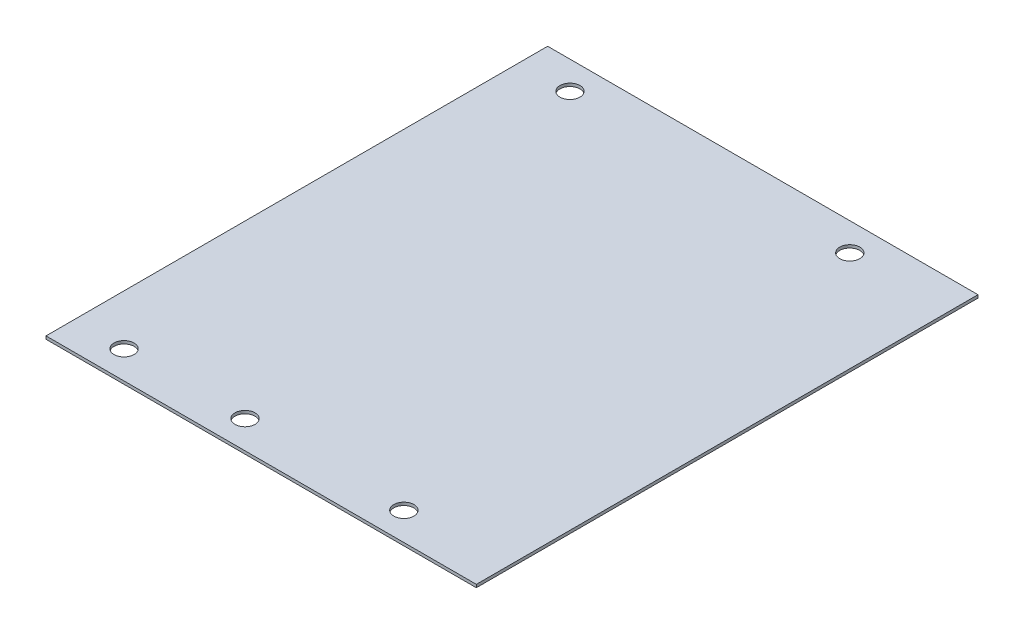
ISO-10303-21;
HEADER;
FILE_DESCRIPTION(('STEP AP214'),'2;1');
FILE_NAME('part.step','',(''),(''),'','','');
FILE_SCHEMA(('AUTOMOTIVE_DESIGN { 1 0 10303 214 1 1 1 1 }'));
ENDSEC;
DATA;
#1=APPLICATION_CONTEXT('core data for automotive mechanical design processes');
#2=APPLICATION_PROTOCOL_DEFINITION('international standard','automotive_design',2000,#1);
#3=PRODUCT_CONTEXT('',#1,'mechanical');
#4=PRODUCT('Part','Part','',(#3));
#5=PRODUCT_RELATED_PRODUCT_CATEGORY('part','',(#4));
#6=PRODUCT_DEFINITION_FORMATION('','',#4);
#7=PRODUCT_DEFINITION_CONTEXT('part definition',#1,'design');
#8=PRODUCT_DEFINITION('design','',#6,#7);
#9=PRODUCT_DEFINITION_SHAPE('','',#8);
#10=(LENGTH_UNIT() NAMED_UNIT(*) SI_UNIT(.MILLI.,.METRE.));
#11=(NAMED_UNIT(*) PLANE_ANGLE_UNIT() SI_UNIT($,.RADIAN.));
#12=(NAMED_UNIT(*) SI_UNIT($,.STERADIAN.) SOLID_ANGLE_UNIT());
#13=UNCERTAINTY_MEASURE_WITH_UNIT(LENGTH_MEASURE(1.E-05),#10,'distance_accuracy_value','');
#14=(GEOMETRIC_REPRESENTATION_CONTEXT(3) GLOBAL_UNCERTAINTY_ASSIGNED_CONTEXT((#13)) GLOBAL_UNIT_ASSIGNED_CONTEXT((#10,
#11,#12)) REPRESENTATION_CONTEXT('',''));
#15=CARTESIAN_POINT('',(0.,0.,0.));
#16=DIRECTION('',(0.,0.,1.));
#17=DIRECTION('',(1.,0.,0.));
#18=AXIS2_PLACEMENT_3D('',#15,#16,#17);
#19=CARTESIAN_POINT('',(-193.,2.66,225.));
#20=DIRECTION('',(1.,0.,0.));
#21=DIRECTION('',(0.,0.,-1.));
#22=AXIS2_PLACEMENT_3D('',#19,#20,#21);
#23=PLANE('',#22);
#24=DIRECTION('',(0.,0.,1.));
#25=VECTOR('',#24,1.);
#26=CARTESIAN_POINT('',(-193.,0.,225.));
#27=LINE('',#26,#25);
#28=CARTESIAN_POINT('',(-193.,0.,-225.));
#29=VERTEX_POINT('',#28);
#30=CARTESIAN_POINT('',(-193.,0.,225.));
#31=VERTEX_POINT('',#30);
#32=EDGE_CURVE('E103',#29,#31,#27,.T.);
#33=ORIENTED_EDGE('',*,*,#32,.T.);
#34=DIRECTION('',(0.,-1.,0.));
#35=VECTOR('',#34,1.);
#36=CARTESIAN_POINT('',(-193.,2.66,225.));
#37=LINE('',#36,#35);
#38=CARTESIAN_POINT('',(-193.,2.66,225.));
#39=VERTEX_POINT('',#38);
#40=EDGE_CURVE('E11',#39,#31,#37,.T.);
#41=ORIENTED_EDGE('',*,*,#40,.F.);
#42=DIRECTION('',(0.,0.,1.));
#43=VECTOR('',#42,1.);
#44=CARTESIAN_POINT('',(-193.,2.66,225.));
#45=LINE('',#44,#43);
#46=CARTESIAN_POINT('',(-193.,2.66,-225.));
#47=VERTEX_POINT('',#46);
#48=EDGE_CURVE('E90',#47,#39,#45,.T.);
#49=ORIENTED_EDGE('',*,*,#48,.F.);
#50=DIRECTION('',(0.,-1.,0.));
#51=VECTOR('',#50,1.);
#52=CARTESIAN_POINT('',(-193.,2.66,-225.));
#53=LINE('',#52,#51);
#54=EDGE_CURVE('E99',#47,#29,#53,.T.);
#55=ORIENTED_EDGE('',*,*,#54,.T.);
#56=EDGE_LOOP('',(#33,#41,#49,#55));
#57=FACE_BOUND('',#56,.T.);
#58=ADVANCED_FACE('F37',(#57),#23,.F.);
#59=CARTESIAN_POINT('',(193.,2.66,225.));
#60=DIRECTION('',(0.,0.,-1.));
#61=DIRECTION('',(-1.,0.,0.));
#62=AXIS2_PLACEMENT_3D('',#59,#60,#61);
#63=PLANE('',#62);
#64=DIRECTION('',(1.,0.,0.));
#65=VECTOR('',#64,1.);
#66=CARTESIAN_POINT('',(193.,0.,225.));
#67=LINE('',#66,#65);
#68=CARTESIAN_POINT('',(193.,0.,225.));
#69=VERTEX_POINT('',#68);
#70=EDGE_CURVE('E94',#31,#69,#67,.T.);
#71=ORIENTED_EDGE('',*,*,#70,.T.);
#72=DIRECTION('',(0.,-1.,0.));
#73=VECTOR('',#72,1.);
#74=CARTESIAN_POINT('',(193.,2.66,225.));
#75=LINE('',#74,#73);
#76=CARTESIAN_POINT('',(193.,2.66,225.));
#77=VERTEX_POINT('',#76);
#78=EDGE_CURVE('E46',#77,#69,#75,.T.);
#79=ORIENTED_EDGE('',*,*,#78,.F.);
#80=DIRECTION('',(1.,0.,0.));
#81=VECTOR('',#80,1.);
#82=CARTESIAN_POINT('',(193.,2.66,225.));
#83=LINE('',#82,#81);
#84=EDGE_CURVE('E85',#39,#77,#83,.T.);
#85=ORIENTED_EDGE('',*,*,#84,.F.);
#86=ORIENTED_EDGE('',*,*,#40,.T.);
#87=EDGE_LOOP('',(#71,#79,#85,#86));
#88=FACE_BOUND('',#87,.T.);
#89=ADVANCED_FACE('F93',(#88),#63,.F.);
#90=CARTESIAN_POINT('',(193.,2.66,225.));
#91=DIRECTION('',(-1.,0.,0.));
#92=DIRECTION('',(0.,0.,1.));
#93=AXIS2_PLACEMENT_3D('',#90,#91,#92);
#94=PLANE('',#93);
#95=DIRECTION('',(0.,0.,-1.));
#96=VECTOR('',#95,1.);
#97=CARTESIAN_POINT('',(193.,0.,225.));
#98=LINE('',#97,#96);
#99=CARTESIAN_POINT('',(193.,0.,-225.));
#100=VERTEX_POINT('',#99);
#101=EDGE_CURVE('E72',#69,#100,#98,.T.);
#102=ORIENTED_EDGE('',*,*,#101,.T.);
#103=DIRECTION('',(0.,-1.,0.));
#104=VECTOR('',#103,1.);
#105=CARTESIAN_POINT('',(193.,2.66,-225.));
#106=LINE('',#105,#104);
#107=CARTESIAN_POINT('',(193.,2.66,-225.));
#108=VERTEX_POINT('',#107);
#109=EDGE_CURVE('E95',#108,#100,#106,.T.);
#110=ORIENTED_EDGE('',*,*,#109,.F.);
#111=DIRECTION('',(0.,0.,-1.));
#112=VECTOR('',#111,1.);
#113=CARTESIAN_POINT('',(193.,2.66,225.));
#114=LINE('',#113,#112);
#115=EDGE_CURVE('E88',#77,#108,#114,.T.);
#116=ORIENTED_EDGE('',*,*,#115,.F.);
#117=ORIENTED_EDGE('',*,*,#78,.T.);
#118=EDGE_LOOP('',(#102,#110,#116,#117));
#119=FACE_BOUND('',#118,.T.);
#120=ADVANCED_FACE('F97',(#119),#94,.F.);
#121=CARTESIAN_POINT('',(193.,2.66,-225.));
#122=DIRECTION('',(0.,0.,1.));
#123=DIRECTION('',(1.,0.,0.));
#124=AXIS2_PLACEMENT_3D('',#121,#122,#123);
#125=PLANE('',#124);
#126=DIRECTION('',(-1.,0.,0.));
#127=VECTOR('',#126,1.);
#128=CARTESIAN_POINT('',(193.,0.,-225.));
#129=LINE('',#128,#127);
#130=EDGE_CURVE('E78',#100,#29,#129,.T.);
#131=ORIENTED_EDGE('',*,*,#130,.T.);
#132=ORIENTED_EDGE('',*,*,#54,.F.);
#133=DIRECTION('',(-1.,0.,0.));
#134=VECTOR('',#133,1.);
#135=CARTESIAN_POINT('',(193.,2.66,-225.));
#136=LINE('',#135,#134);
#137=EDGE_CURVE('E55',#108,#47,#136,.T.);
#138=ORIENTED_EDGE('',*,*,#137,.F.);
#139=ORIENTED_EDGE('',*,*,#109,.T.);
#140=EDGE_LOOP('',(#131,#132,#138,#139));
#141=FACE_BOUND('',#140,.T.);
#142=ADVANCED_FACE('F151',(#141),#125,.F.);
#143=CARTESIAN_POINT('',(0.,2.66,0.));
#144=DIRECTION('',(0.,1.,0.));
#145=DIRECTION('',(0.,0.,1.));
#146=AXIS2_PLACEMENT_3D('',#143,#144,#145);
#147=PLANE('',#146);
#148=CARTESIAN_POINT('',(103.,2.66,200.));
#149=DIRECTION('',(0.,1.,0.));
#150=DIRECTION('',(0.,0.,1.));
#151=AXIS2_PLACEMENT_3D('',#148,#149,#150);
#152=CIRCLE('',#151,9.);
#153=CARTESIAN_POINT('',(103.,2.66,209.));
#154=VERTEX_POINT('',#153);
#155=EDGE_CURVE('E139',#154,#154,#152,.T.);
#156=ORIENTED_EDGE('',*,*,#155,.F.);
#157=EDGE_LOOP('',(#156));
#158=FACE_BOUND('',#157,.T.);
#159=CARTESIAN_POINT('',(-39.4999999999999,2.66,200.));
#160=DIRECTION('',(0.,1.,0.));
#161=DIRECTION('',(0.,0.,1.));
#162=AXIS2_PLACEMENT_3D('',#159,#160,#161);
#163=CIRCLE('',#162,9.00000000000001);
#164=CARTESIAN_POINT('',(-39.4999999999999,2.66,209.));
#165=VERTEX_POINT('',#164);
#166=EDGE_CURVE('E136',#165,#165,#163,.T.);
#167=ORIENTED_EDGE('',*,*,#166,.F.);
#168=EDGE_LOOP('',(#167));
#169=FACE_BOUND('',#168,.T.);
#170=CARTESIAN_POINT('',(-148.,2.66,200.));
#171=DIRECTION('',(0.,1.,0.));
#172=DIRECTION('',(0.,0.,1.));
#173=AXIS2_PLACEMENT_3D('',#170,#171,#172);
#174=CIRCLE('',#173,9.00000000000001);
#175=CARTESIAN_POINT('',(-148.,2.66,209.));
#176=VERTEX_POINT('',#175);
#177=EDGE_CURVE('E133',#176,#176,#174,.T.);
#178=ORIENTED_EDGE('',*,*,#177,.F.);
#179=EDGE_LOOP('',(#178));
#180=FACE_BOUND('',#179,.T.);
#181=CARTESIAN_POINT('',(103.,2.66,-200.));
#182=DIRECTION('',(0.,1.,0.));
#183=DIRECTION('',(0.,0.,1.));
#184=AXIS2_PLACEMENT_3D('',#181,#182,#183);
#185=CIRCLE('',#184,9.00000000000001);
#186=CARTESIAN_POINT('',(103.,2.66,-191.));
#187=VERTEX_POINT('',#186);
#188=EDGE_CURVE('E119',#187,#187,#185,.T.);
#189=ORIENTED_EDGE('',*,*,#188,.F.);
#190=EDGE_LOOP('',(#189));
#191=FACE_BOUND('',#190,.T.);
#192=CARTESIAN_POINT('',(-148.,2.66,-200.));
#193=DIRECTION('',(0.,1.,0.));
#194=DIRECTION('',(0.,0.,1.));
#195=AXIS2_PLACEMENT_3D('',#192,#193,#194);
#196=CIRCLE('',#195,9.00000000000001);
#197=CARTESIAN_POINT('',(-148.,2.66,-191.));
#198=VERTEX_POINT('',#197);
#199=EDGE_CURVE('E114',#198,#198,#196,.T.);
#200=ORIENTED_EDGE('',*,*,#199,.F.);
#201=EDGE_LOOP('',(#200));
#202=FACE_BOUND('',#201,.T.);
#203=ORIENTED_EDGE('',*,*,#48,.T.);
#204=ORIENTED_EDGE('',*,*,#84,.T.);
#205=ORIENTED_EDGE('',*,*,#115,.T.);
#206=ORIENTED_EDGE('',*,*,#137,.T.);
#207=EDGE_LOOP('',(#203,#204,#205,#206));
#208=FACE_BOUND('',#207,.T.);
#209=ADVANCED_FACE('F86',(#158,#169,#180,#191,#202,#208),#147,.T.);
#210=CARTESIAN_POINT('',(0.,0.,0.));
#211=DIRECTION('',(0.,1.,0.));
#212=DIRECTION('',(0.,0.,1.));
#213=AXIS2_PLACEMENT_3D('',#210,#211,#212);
#214=PLANE('',#213);
#215=CARTESIAN_POINT('',(103.,0.,200.));
#216=DIRECTION('',(0.,1.,0.));
#217=DIRECTION('',(0.,0.,1.));
#218=AXIS2_PLACEMENT_3D('',#215,#216,#217);
#219=CIRCLE('',#218,9.);
#220=CARTESIAN_POINT('',(103.,0.,209.));
#221=VERTEX_POINT('',#220);
#222=EDGE_CURVE('E40',#221,#221,#219,.T.);
#223=ORIENTED_EDGE('',*,*,#222,.T.);
#224=EDGE_LOOP('',(#223));
#225=FACE_BOUND('',#224,.T.);
#226=CARTESIAN_POINT('',(-39.4999999999999,0.,200.));
#227=DIRECTION('',(0.,1.,0.));
#228=DIRECTION('',(0.,0.,1.));
#229=AXIS2_PLACEMENT_3D('',#226,#227,#228);
#230=CIRCLE('',#229,9.00000000000001);
#231=CARTESIAN_POINT('',(-39.4999999999999,0.,209.));
#232=VERTEX_POINT('',#231);
#233=EDGE_CURVE('E121',#232,#232,#230,.T.);
#234=ORIENTED_EDGE('',*,*,#233,.T.);
#235=EDGE_LOOP('',(#234));
#236=FACE_BOUND('',#235,.T.);
#237=CARTESIAN_POINT('',(-148.,0.,200.));
#238=DIRECTION('',(0.,1.,0.));
#239=DIRECTION('',(0.,0.,1.));
#240=AXIS2_PLACEMENT_3D('',#237,#238,#239);
#241=CIRCLE('',#240,9.00000000000001);
#242=CARTESIAN_POINT('',(-148.,0.,209.));
#243=VERTEX_POINT('',#242);
#244=EDGE_CURVE('E118',#243,#243,#241,.T.);
#245=ORIENTED_EDGE('',*,*,#244,.T.);
#246=EDGE_LOOP('',(#245));
#247=FACE_BOUND('',#246,.T.);
#248=CARTESIAN_POINT('',(103.,0.,-200.));
#249=DIRECTION('',(0.,1.,0.));
#250=DIRECTION('',(0.,0.,1.));
#251=AXIS2_PLACEMENT_3D('',#248,#249,#250);
#252=CIRCLE('',#251,9.00000000000001);
#253=CARTESIAN_POINT('',(103.,0.,-191.));
#254=VERTEX_POINT('',#253);
#255=EDGE_CURVE('E115',#254,#254,#252,.T.);
#256=ORIENTED_EDGE('',*,*,#255,.T.);
#257=EDGE_LOOP('',(#256));
#258=FACE_BOUND('',#257,.T.);
#259=CARTESIAN_POINT('',(-148.,0.,-200.));
#260=DIRECTION('',(0.,1.,0.));
#261=DIRECTION('',(0.,0.,1.));
#262=AXIS2_PLACEMENT_3D('',#259,#260,#261);
#263=CIRCLE('',#262,9.00000000000001);
#264=CARTESIAN_POINT('',(-148.,0.,-191.));
#265=VERTEX_POINT('',#264);
#266=EDGE_CURVE('E106',#265,#265,#263,.T.);
#267=ORIENTED_EDGE('',*,*,#266,.T.);
#268=EDGE_LOOP('',(#267));
#269=FACE_BOUND('',#268,.T.);
#270=ORIENTED_EDGE('',*,*,#32,.F.);
#271=ORIENTED_EDGE('',*,*,#130,.F.);
#272=ORIENTED_EDGE('',*,*,#101,.F.);
#273=ORIENTED_EDGE('',*,*,#70,.F.);
#274=EDGE_LOOP('',(#270,#271,#272,#273));
#275=FACE_BOUND('',#274,.T.);
#276=ADVANCED_FACE('F150',(#225,#236,#247,#258,#269,#275),#214,.F.);
#277=CARTESIAN_POINT('',(-148.,-0.34,-200.));
#278=DIRECTION('',(0.,1.,0.));
#279=DIRECTION('',(0.,0.,1.));
#280=AXIS2_PLACEMENT_3D('',#277,#278,#279);
#281=CYLINDRICAL_SURFACE('',#280,9.00000000000001);
#282=ORIENTED_EDGE('',*,*,#199,.T.);
#283=EDGE_LOOP('',(#282));
#284=FACE_BOUND('',#283,.T.);
#285=ORIENTED_EDGE('',*,*,#266,.F.);
#286=EDGE_LOOP('',(#285));
#287=FACE_BOUND('',#286,.T.);
#288=ADVANCED_FACE('F163',(#284,#287),#281,.F.);
#289=CARTESIAN_POINT('',(103.,-0.34,-200.));
#290=DIRECTION('',(0.,1.,0.));
#291=DIRECTION('',(0.,0.,1.));
#292=AXIS2_PLACEMENT_3D('',#289,#290,#291);
#293=CYLINDRICAL_SURFACE('',#292,9.00000000000001);
#294=ORIENTED_EDGE('',*,*,#188,.T.);
#295=EDGE_LOOP('',(#294));
#296=FACE_BOUND('',#295,.T.);
#297=ORIENTED_EDGE('',*,*,#255,.F.);
#298=EDGE_LOOP('',(#297));
#299=FACE_BOUND('',#298,.T.);
#300=ADVANCED_FACE('F159',(#296,#299),#293,.F.);
#301=CARTESIAN_POINT('',(-148.,-0.34,200.));
#302=DIRECTION('',(0.,1.,0.));
#303=DIRECTION('',(0.,0.,1.));
#304=AXIS2_PLACEMENT_3D('',#301,#302,#303);
#305=CYLINDRICAL_SURFACE('',#304,9.00000000000001);
#306=ORIENTED_EDGE('',*,*,#177,.T.);
#307=EDGE_LOOP('',(#306));
#308=FACE_BOUND('',#307,.T.);
#309=ORIENTED_EDGE('',*,*,#244,.F.);
#310=EDGE_LOOP('',(#309));
#311=FACE_BOUND('',#310,.T.);
#312=ADVANCED_FACE('F162',(#308,#311),#305,.F.);
#313=CARTESIAN_POINT('',(-39.4999999999999,-0.34,200.));
#314=DIRECTION('',(0.,1.,0.));
#315=DIRECTION('',(0.,0.,1.));
#316=AXIS2_PLACEMENT_3D('',#313,#314,#315);
#317=CYLINDRICAL_SURFACE('',#316,9.00000000000001);
#318=ORIENTED_EDGE('',*,*,#166,.T.);
#319=EDGE_LOOP('',(#318));
#320=FACE_BOUND('',#319,.T.);
#321=ORIENTED_EDGE('',*,*,#233,.F.);
#322=EDGE_LOOP('',(#321));
#323=FACE_BOUND('',#322,.T.);
#324=ADVANCED_FACE('F145',(#320,#323),#317,.F.);
#325=CARTESIAN_POINT('',(103.,-0.34,200.));
#326=DIRECTION('',(0.,1.,0.));
#327=DIRECTION('',(0.,0.,1.));
#328=AXIS2_PLACEMENT_3D('',#325,#326,#327);
#329=CYLINDRICAL_SURFACE('',#328,9.);
#330=ORIENTED_EDGE('',*,*,#155,.T.);
#331=EDGE_LOOP('',(#330));
#332=FACE_BOUND('',#331,.T.);
#333=ORIENTED_EDGE('',*,*,#222,.F.);
#334=EDGE_LOOP('',(#333));
#335=FACE_BOUND('',#334,.T.);
#336=ADVANCED_FACE('F238',(#332,#335),#329,.F.);
#337=CLOSED_SHELL('',(#58,#89,#120,#142,#209,#276,#288,#300,#312,#324,#336));
#338=MANIFOLD_SOLID_BREP('B2',#337);
#339=ADVANCED_BREP_SHAPE_REPRESENTATION('',(#18,#338),#14);
#340=SHAPE_DEFINITION_REPRESENTATION(#9,#339);
ENDSEC;
END-ISO-10303-21;
